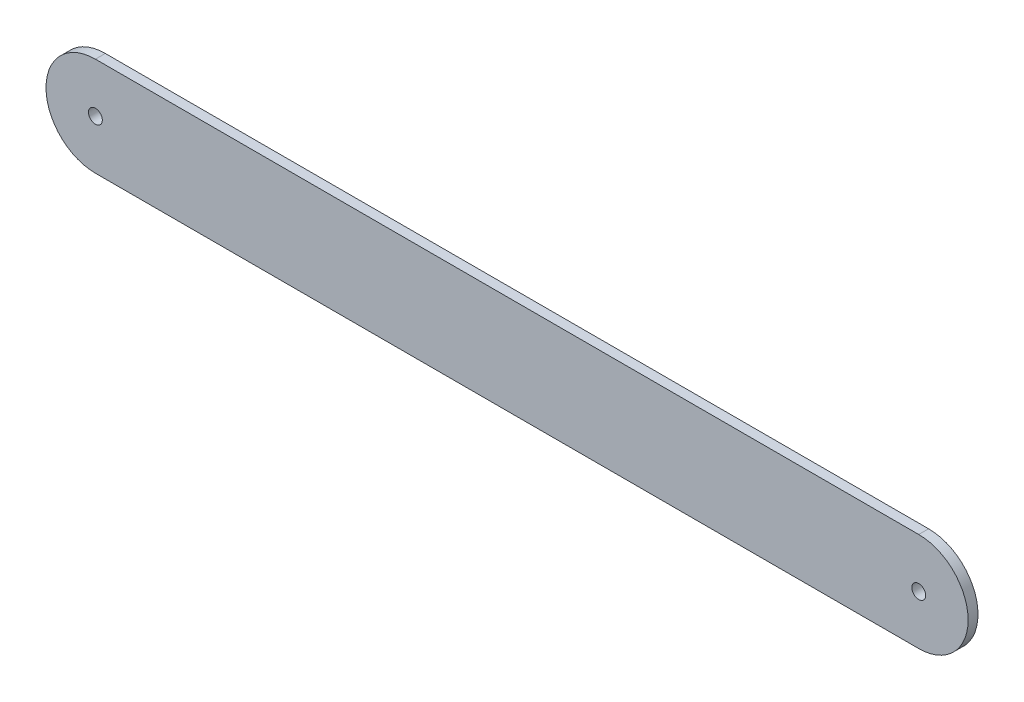
ISO-10303-21;
HEADER;
FILE_DESCRIPTION(('STEP AP214'),'2;1');
FILE_NAME('part.step','',(''),(''),'','','');
FILE_SCHEMA(('AUTOMOTIVE_DESIGN { 1 0 10303 214 1 1 1 1 }'));
ENDSEC;
DATA;
#1=APPLICATION_CONTEXT('core data for automotive mechanical design processes');
#2=APPLICATION_PROTOCOL_DEFINITION('international standard','automotive_design',2000,#1);
#3=PRODUCT_CONTEXT('',#1,'mechanical');
#4=PRODUCT('Part','Part','',(#3));
#5=PRODUCT_RELATED_PRODUCT_CATEGORY('part','',(#4));
#6=PRODUCT_DEFINITION_FORMATION('','',#4);
#7=PRODUCT_DEFINITION_CONTEXT('part definition',#1,'design');
#8=PRODUCT_DEFINITION('design','',#6,#7);
#9=PRODUCT_DEFINITION_SHAPE('','',#8);
#10=(LENGTH_UNIT() NAMED_UNIT(*) SI_UNIT(.MILLI.,.METRE.));
#11=(NAMED_UNIT(*) PLANE_ANGLE_UNIT() SI_UNIT($,.RADIAN.));
#12=(NAMED_UNIT(*) SI_UNIT($,.STERADIAN.) SOLID_ANGLE_UNIT());
#13=UNCERTAINTY_MEASURE_WITH_UNIT(LENGTH_MEASURE(1.E-05),#10,'distance_accuracy_value','');
#14=(GEOMETRIC_REPRESENTATION_CONTEXT(3) GLOBAL_UNCERTAINTY_ASSIGNED_CONTEXT((#13)) GLOBAL_UNIT_ASSIGNED_CONTEXT((#10,
#11,#12)) REPRESENTATION_CONTEXT('',''));
#15=CARTESIAN_POINT('',(0.,0.,0.));
#16=DIRECTION('',(0.,0.,1.));
#17=DIRECTION('',(1.,0.,0.));
#18=AXIS2_PLACEMENT_3D('',#15,#16,#17);
#19=CARTESIAN_POINT('',(125.,0.,3.));
#20=DIRECTION('',(0.,0.,-1.));
#21=DIRECTION('',(-1.,0.,0.));
#22=AXIS2_PLACEMENT_3D('',#19,#20,#21);
#23=PLANE('',#22);
#24=DIRECTION('',(-1.,0.,0.));
#25=VECTOR('',#24,1.);
#26=CARTESIAN_POINT('',(0.,15.,3.));
#27=LINE('',#26,#25);
#28=CARTESIAN_POINT('',(125.,15.,3.));
#29=VERTEX_POINT('',#28);
#30=CARTESIAN_POINT('',(-125.,15.,3.));
#31=VERTEX_POINT('',#30);
#32=EDGE_CURVE('E75',#29,#31,#27,.T.);
#33=ORIENTED_EDGE('',*,*,#32,.T.);
#34=CARTESIAN_POINT('',(-125.,0.,3.));
#35=DIRECTION('',(0.,0.,-1.));
#36=DIRECTION('',(1.,0.,0.));
#37=AXIS2_PLACEMENT_3D('',#34,#35,#36);
#38=CIRCLE('',#37,15.);
#39=CARTESIAN_POINT('',(-125.,-15.,3.));
#40=VERTEX_POINT('',#39);
#41=EDGE_CURVE('E102',#40,#31,#38,.T.);
#42=ORIENTED_EDGE('',*,*,#41,.F.);
#43=DIRECTION('',(1.,0.,0.));
#44=VECTOR('',#43,1.);
#45=CARTESIAN_POINT('',(0.,-15.,3.));
#46=LINE('',#45,#44);
#47=CARTESIAN_POINT('',(125.,-15.,3.));
#48=VERTEX_POINT('',#47);
#49=EDGE_CURVE('E94',#40,#48,#46,.T.);
#50=ORIENTED_EDGE('',*,*,#49,.T.);
#51=CARTESIAN_POINT('',(125.,0.,3.));
#52=DIRECTION('',(0.,0.,1.));
#53=DIRECTION('',(-1.,0.,0.));
#54=AXIS2_PLACEMENT_3D('',#51,#52,#53);
#55=CIRCLE('',#54,15.);
#56=EDGE_CURVE('E58',#48,#29,#55,.T.);
#57=ORIENTED_EDGE('',*,*,#56,.T.);
#58=EDGE_LOOP('',(#33,#42,#50,#57));
#59=FACE_BOUND('',#58,.T.);
#60=CARTESIAN_POINT('',(125.,0.,3.));
#61=DIRECTION('',(0.,0.,1.));
#62=DIRECTION('',(1.,0.,0.));
#63=AXIS2_PLACEMENT_3D('',#60,#61,#62);
#64=CIRCLE('',#63,2.09999999999999);
#65=CARTESIAN_POINT('',(127.1,0.,3.));
#66=VERTEX_POINT('',#65);
#67=EDGE_CURVE('E117',#66,#66,#64,.T.);
#68=ORIENTED_EDGE('',*,*,#67,.F.);
#69=EDGE_LOOP('',(#68));
#70=FACE_BOUND('',#69,.T.);
#71=CARTESIAN_POINT('',(-125.,0.,3.));
#72=DIRECTION('',(0.,0.,-1.));
#73=DIRECTION('',(-1.,0.,0.));
#74=AXIS2_PLACEMENT_3D('',#71,#72,#73);
#75=CIRCLE('',#74,2.09999999999999);
#76=CARTESIAN_POINT('',(-127.1,0.,3.));
#77=VERTEX_POINT('',#76);
#78=EDGE_CURVE('E107',#77,#77,#75,.T.);
#79=ORIENTED_EDGE('',*,*,#78,.T.);
#80=EDGE_LOOP('',(#79));
#81=FACE_BOUND('',#80,.T.);
#82=ADVANCED_FACE('F41',(#59,#70,#81),#23,.F.);
#83=CARTESIAN_POINT('',(125.,0.,0.));
#84=DIRECTION('',(0.,0.,-1.));
#85=DIRECTION('',(-1.,0.,0.));
#86=AXIS2_PLACEMENT_3D('',#83,#84,#85);
#87=PLANE('',#86);
#88=DIRECTION('',(1.,0.,0.));
#89=VECTOR('',#88,1.);
#90=CARTESIAN_POINT('',(0.,-15.,0.));
#91=LINE('',#90,#89);
#92=CARTESIAN_POINT('',(-125.,-15.,0.));
#93=VERTEX_POINT('',#92);
#94=CARTESIAN_POINT('',(125.,-15.,0.));
#95=VERTEX_POINT('',#94);
#96=EDGE_CURVE('E69',#93,#95,#91,.T.);
#97=ORIENTED_EDGE('',*,*,#96,.F.);
#98=CARTESIAN_POINT('',(-125.,0.,0.));
#99=DIRECTION('',(0.,0.,-1.));
#100=DIRECTION('',(1.,0.,0.));
#101=AXIS2_PLACEMENT_3D('',#98,#99,#100);
#102=CIRCLE('',#101,15.);
#103=CARTESIAN_POINT('',(-125.,15.,0.));
#104=VERTEX_POINT('',#103);
#105=EDGE_CURVE('E101',#93,#104,#102,.T.);
#106=ORIENTED_EDGE('',*,*,#105,.T.);
#107=DIRECTION('',(-1.,0.,0.));
#108=VECTOR('',#107,1.);
#109=CARTESIAN_POINT('',(0.,15.,0.));
#110=LINE('',#109,#108);
#111=CARTESIAN_POINT('',(125.,15.,0.));
#112=VERTEX_POINT('',#111);
#113=EDGE_CURVE('E86',#112,#104,#110,.T.);
#114=ORIENTED_EDGE('',*,*,#113,.F.);
#115=CARTESIAN_POINT('',(125.,0.,0.));
#116=DIRECTION('',(0.,0.,1.));
#117=DIRECTION('',(-1.,0.,0.));
#118=AXIS2_PLACEMENT_3D('',#115,#116,#117);
#119=CIRCLE('',#118,15.);
#120=EDGE_CURVE('E95',#95,#112,#119,.T.);
#121=ORIENTED_EDGE('',*,*,#120,.F.);
#122=EDGE_LOOP('',(#97,#106,#114,#121));
#123=FACE_BOUND('',#122,.T.);
#124=CARTESIAN_POINT('',(125.,0.,0.));
#125=DIRECTION('',(0.,0.,1.));
#126=DIRECTION('',(1.,0.,0.));
#127=AXIS2_PLACEMENT_3D('',#124,#125,#126);
#128=CIRCLE('',#127,2.09999999999999);
#129=CARTESIAN_POINT('',(127.1,0.,0.));
#130=VERTEX_POINT('',#129);
#131=EDGE_CURVE('E116',#130,#130,#128,.T.);
#132=ORIENTED_EDGE('',*,*,#131,.T.);
#133=EDGE_LOOP('',(#132));
#134=FACE_BOUND('',#133,.T.);
#135=CARTESIAN_POINT('',(-125.,0.,0.));
#136=DIRECTION('',(0.,0.,-1.));
#137=DIRECTION('',(-1.,0.,0.));
#138=AXIS2_PLACEMENT_3D('',#135,#136,#137);
#139=CIRCLE('',#138,2.09999999999999);
#140=CARTESIAN_POINT('',(-127.1,0.,0.));
#141=VERTEX_POINT('',#140);
#142=EDGE_CURVE('E111',#141,#141,#139,.T.);
#143=ORIENTED_EDGE('',*,*,#142,.F.);
#144=EDGE_LOOP('',(#143));
#145=FACE_BOUND('',#144,.T.);
#146=ADVANCED_FACE('F105',(#123,#134,#145),#87,.T.);
#147=CARTESIAN_POINT('',(0.,-15.,3.));
#148=DIRECTION('',(0.,1.,0.));
#149=DIRECTION('',(0.,0.,1.));
#150=AXIS2_PLACEMENT_3D('',#147,#148,#149);
#151=PLANE('',#150);
#152=ORIENTED_EDGE('',*,*,#96,.T.);
#153=DIRECTION('',(0.,0.,-1.));
#154=VECTOR('',#153,1.);
#155=CARTESIAN_POINT('',(125.,-15.,3.));
#156=LINE('',#155,#154);
#157=EDGE_CURVE('E11',#48,#95,#156,.T.);
#158=ORIENTED_EDGE('',*,*,#157,.F.);
#159=ORIENTED_EDGE('',*,*,#49,.F.);
#160=DIRECTION('',(0.,0.,-1.));
#161=VECTOR('',#160,1.);
#162=CARTESIAN_POINT('',(-125.,-15.,3.));
#163=LINE('',#162,#161);
#164=EDGE_CURVE('E103',#40,#93,#163,.T.);
#165=ORIENTED_EDGE('',*,*,#164,.T.);
#166=EDGE_LOOP('',(#152,#158,#159,#165));
#167=FACE_BOUND('',#166,.T.);
#168=ADVANCED_FACE('F43',(#167),#151,.F.);
#169=CARTESIAN_POINT('',(125.,0.,3.));
#170=DIRECTION('',(0.,0.,-1.));
#171=DIRECTION('',(-1.,0.,0.));
#172=AXIS2_PLACEMENT_3D('',#169,#170,#171);
#173=CYLINDRICAL_SURFACE('',#172,15.);
#174=ORIENTED_EDGE('',*,*,#120,.T.);
#175=DIRECTION('',(0.,0.,-1.));
#176=VECTOR('',#175,1.);
#177=CARTESIAN_POINT('',(125.,15.,3.));
#178=LINE('',#177,#176);
#179=EDGE_CURVE('E50',#29,#112,#178,.T.);
#180=ORIENTED_EDGE('',*,*,#179,.F.);
#181=ORIENTED_EDGE('',*,*,#56,.F.);
#182=ORIENTED_EDGE('',*,*,#157,.T.);
#183=EDGE_LOOP('',(#174,#180,#181,#182));
#184=FACE_BOUND('',#183,.T.);
#185=ADVANCED_FACE('F127',(#184),#173,.T.);
#186=CARTESIAN_POINT('',(0.,15.,3.));
#187=DIRECTION('',(0.,-1.,0.));
#188=DIRECTION('',(1.,0.,0.));
#189=AXIS2_PLACEMENT_3D('',#186,#187,#188);
#190=PLANE('',#189);
#191=ORIENTED_EDGE('',*,*,#113,.T.);
#192=DIRECTION('',(0.,0.,-1.));
#193=VECTOR('',#192,1.);
#194=CARTESIAN_POINT('',(-125.,15.,3.));
#195=LINE('',#194,#193);
#196=EDGE_CURVE('E89',#31,#104,#195,.T.);
#197=ORIENTED_EDGE('',*,*,#196,.F.);
#198=ORIENTED_EDGE('',*,*,#32,.F.);
#199=ORIENTED_EDGE('',*,*,#179,.T.);
#200=EDGE_LOOP('',(#191,#197,#198,#199));
#201=FACE_BOUND('',#200,.T.);
#202=ADVANCED_FACE('F88',(#201),#190,.F.);
#203=CARTESIAN_POINT('',(125.,0.,3.));
#204=DIRECTION('',(0.,0.,-1.));
#205=DIRECTION('',(-1.,0.,0.));
#206=AXIS2_PLACEMENT_3D('',#203,#204,#205);
#207=CYLINDRICAL_SURFACE('',#206,2.09999999999999);
#208=ORIENTED_EDGE('',*,*,#67,.T.);
#209=EDGE_LOOP('',(#208));
#210=FACE_BOUND('',#209,.T.);
#211=ORIENTED_EDGE('',*,*,#131,.F.);
#212=EDGE_LOOP('',(#211));
#213=FACE_BOUND('',#212,.T.);
#214=ADVANCED_FACE('F150',(#210,#213),#207,.F.);
#215=CARTESIAN_POINT('',(-125.,0.,3.));
#216=DIRECTION('',(0.,0.,-1.));
#217=DIRECTION('',(1.,0.,0.));
#218=AXIS2_PLACEMENT_3D('',#215,#216,#217);
#219=CYLINDRICAL_SURFACE('',#218,15.);
#220=ORIENTED_EDGE('',*,*,#105,.F.);
#221=ORIENTED_EDGE('',*,*,#164,.F.);
#222=ORIENTED_EDGE('',*,*,#41,.T.);
#223=ORIENTED_EDGE('',*,*,#196,.T.);
#224=EDGE_LOOP('',(#220,#221,#222,#223));
#225=FACE_BOUND('',#224,.T.);
#226=ADVANCED_FACE('F99',(#225),#219,.T.);
#227=CARTESIAN_POINT('',(-125.,0.,3.));
#228=DIRECTION('',(0.,0.,-1.));
#229=DIRECTION('',(1.,0.,0.));
#230=AXIS2_PLACEMENT_3D('',#227,#228,#229);
#231=CYLINDRICAL_SURFACE('',#230,2.09999999999999);
#232=ORIENTED_EDGE('',*,*,#78,.F.);
#233=EDGE_LOOP('',(#232));
#234=FACE_BOUND('',#233,.T.);
#235=ORIENTED_EDGE('',*,*,#142,.T.);
#236=EDGE_LOOP('',(#235));
#237=FACE_BOUND('',#236,.T.);
#238=ADVANCED_FACE('F135',(#234,#237),#231,.F.);
#239=CLOSED_SHELL('',(#82,#146,#168,#185,#202,#214,#226,#238));
#240=MANIFOLD_SOLID_BREP('B2',#239);
#241=ADVANCED_BREP_SHAPE_REPRESENTATION('',(#18,#240),#14);
#242=SHAPE_DEFINITION_REPRESENTATION(#9,#241);
ENDSEC;
END-ISO-10303-21;
